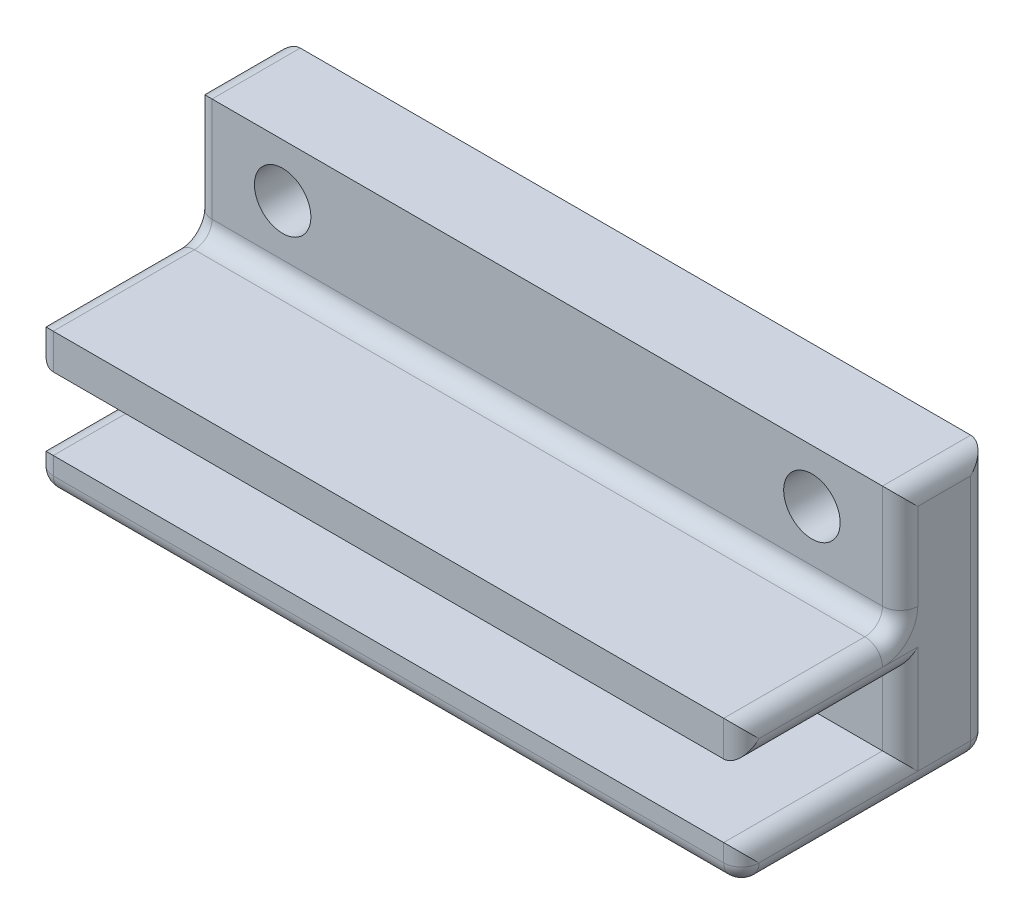
ISO-10303-21;
HEADER;
FILE_DESCRIPTION(('STEP AP214'),'2;1');
FILE_NAME('part.step','',(''),(''),'','','');
FILE_SCHEMA(('AUTOMOTIVE_DESIGN { 1 0 10303 214 1 1 1 1 }'));
ENDSEC;
DATA;
#1=APPLICATION_CONTEXT('core data for automotive mechanical design processes');
#2=APPLICATION_PROTOCOL_DEFINITION('international standard','automotive_design',2000,#1);
#3=PRODUCT_CONTEXT('',#1,'mechanical');
#4=PRODUCT('Part','Part','',(#3));
#5=PRODUCT_RELATED_PRODUCT_CATEGORY('part','',(#4));
#6=PRODUCT_DEFINITION_FORMATION('','',#4);
#7=PRODUCT_DEFINITION_CONTEXT('part definition',#1,'design');
#8=PRODUCT_DEFINITION('design','',#6,#7);
#9=PRODUCT_DEFINITION_SHAPE('','',#8);
#10=(LENGTH_UNIT() NAMED_UNIT(*) SI_UNIT(.MILLI.,.METRE.));
#11=(NAMED_UNIT(*) PLANE_ANGLE_UNIT() SI_UNIT($,.RADIAN.));
#12=(NAMED_UNIT(*) SI_UNIT($,.STERADIAN.) SOLID_ANGLE_UNIT());
#13=UNCERTAINTY_MEASURE_WITH_UNIT(LENGTH_MEASURE(1.E-05),#10,'distance_accuracy_value','');
#14=(GEOMETRIC_REPRESENTATION_CONTEXT(3) GLOBAL_UNCERTAINTY_ASSIGNED_CONTEXT((#13)) GLOBAL_UNIT_ASSIGNED_CONTEXT((#10,
#11,#12)) REPRESENTATION_CONTEXT('',''));
#15=CARTESIAN_POINT('',(0.,0.,0.));
#16=DIRECTION('',(0.,0.,1.));
#17=DIRECTION('',(1.,0.,0.));
#18=AXIS2_PLACEMENT_3D('',#15,#16,#17);
#19=CARTESIAN_POINT('',(20.,0.,5.));
#20=DIRECTION('',(-1.,0.,0.));
#21=DIRECTION('',(0.,-1.,0.));
#22=AXIS2_PLACEMENT_3D('',#19,#20,#21);
#23=PLANE('',#22);
#24=CARTESIAN_POINT('',(20.,1.6,6.));
#25=DIRECTION('',(-1.,0.,0.));
#26=DIRECTION('',(0.,-1.,0.));
#27=AXIS2_PLACEMENT_3D('',#24,#25,#26);
#28=CIRCLE('',#27,2.);
#29=CARTESIAN_POINT('',(20.,-0.400000000000001,6.));
#30=VERTEX_POINT('',#29);
#31=CARTESIAN_POINT('',(20.,1.6,4.));
#32=VERTEX_POINT('',#31);
#33=EDGE_CURVE('E11',#30,#32,#28,.F.);
#34=ORIENTED_EDGE('',*,*,#33,.F.);
#35=DIRECTION('',(0.,0.,-1.));
#36=VECTOR('',#35,1.);
#37=CARTESIAN_POINT('',(20.,-0.400000000000001,5.));
#38=LINE('',#37,#36);
#39=CARTESIAN_POINT('',(20.,-0.400000000000001,4.));
#40=VERTEX_POINT('',#39);
#41=EDGE_CURVE('E47',#30,#40,#38,.T.);
#42=ORIENTED_EDGE('',*,*,#41,.T.);
#43=DIRECTION('',(0.,1.,0.));
#44=VECTOR('',#43,1.);
#45=CARTESIAN_POINT('',(20.,-5.5,4.));
#46=LINE('',#45,#44);
#47=CARTESIAN_POINT('',(20.,-6.5,4.));
#48=VERTEX_POINT('',#47);
#49=EDGE_CURVE('E365',#40,#48,#46,.F.);
#50=ORIENTED_EDGE('',*,*,#49,.T.);
#51=DIRECTION('',(0.,0.,-1.));
#52=VECTOR('',#51,1.);
#53=CARTESIAN_POINT('',(20.,-6.5,5.));
#54=LINE('',#53,#52);
#55=CARTESIAN_POINT('',(20.,-6.5,1.));
#56=VERTEX_POINT('',#55);
#57=EDGE_CURVE('E367',#48,#56,#54,.T.);
#58=ORIENTED_EDGE('',*,*,#57,.T.);
#59=DIRECTION('',(0.,1.,0.));
#60=VECTOR('',#59,1.);
#61=CARTESIAN_POINT('',(20.,0.,1.));
#62=LINE('',#61,#60);
#63=CARTESIAN_POINT('',(20.,6.5,1.));
#64=VERTEX_POINT('',#63);
#65=EDGE_CURVE('E203',#56,#64,#62,.T.);
#66=ORIENTED_EDGE('',*,*,#65,.T.);
#67=DIRECTION('',(0.,0.,-1.));
#68=VECTOR('',#67,1.);
#69=CARTESIAN_POINT('',(20.,6.5,5.));
#70=LINE('',#69,#68);
#71=CARTESIAN_POINT('',(20.,6.5,4.));
#72=VERTEX_POINT('',#71);
#73=EDGE_CURVE('E199',#64,#72,#70,.F.);
#74=ORIENTED_EDGE('',*,*,#73,.T.);
#75=DIRECTION('',(0.,1.,0.));
#76=VECTOR('',#75,1.);
#77=CARTESIAN_POINT('',(20.,0.599999999999996,4.));
#78=LINE('',#77,#76);
#79=EDGE_CURVE('E201',#72,#32,#78,.F.);
#80=ORIENTED_EDGE('',*,*,#79,.T.);
#81=EDGE_LOOP('',(#34,#42,#50,#58,#66,#74,#80));
#82=FACE_BOUND('',#81,.T.);
#83=ADVANCED_FACE('F37',(#82),#23,.F.);
#84=CARTESIAN_POINT('',(0.,0.,5.));
#85=DIRECTION('',(0.,0.,1.));
#86=DIRECTION('',(1.,0.,0.));
#87=AXIS2_PLACEMENT_3D('',#84,#85,#86);
#88=PLANE('',#87);
#89=DIRECTION('',(-1.,0.,0.));
#90=VECTOR('',#89,1.);
#91=CARTESIAN_POINT('',(0.,-1.4,5.));
#92=LINE('',#91,#90);
#93=CARTESIAN_POINT('',(19.,-1.4,5.));
#94=VERTEX_POINT('',#93);
#95=CARTESIAN_POINT('',(-19.,-1.40000000000001,5.));
#96=VERTEX_POINT('',#95);
#97=EDGE_CURVE('E275',#94,#96,#92,.T.);
#98=ORIENTED_EDGE('',*,*,#97,.T.);
#99=DIRECTION('',(0.,1.,0.));
#100=VECTOR('',#99,1.);
#101=CARTESIAN_POINT('',(-19.,0.,5.));
#102=LINE('',#101,#100);
#103=CARTESIAN_POINT('',(-19.,-5.50000000000001,5.));
#104=VERTEX_POINT('',#103);
#105=EDGE_CURVE('E357',#96,#104,#102,.F.);
#106=ORIENTED_EDGE('',*,*,#105,.T.);
#107=DIRECTION('',(-1.,0.,0.));
#108=VECTOR('',#107,1.);
#109=CARTESIAN_POINT('',(0.,-5.5,5.));
#110=LINE('',#109,#108);
#111=CARTESIAN_POINT('',(19.,-5.5,5.));
#112=VERTEX_POINT('',#111);
#113=EDGE_CURVE('E264',#112,#104,#110,.T.);
#114=ORIENTED_EDGE('',*,*,#113,.F.);
#115=DIRECTION('',(0.,1.,0.));
#116=VECTOR('',#115,1.);
#117=CARTESIAN_POINT('',(19.,-1.4,5.));
#118=LINE('',#117,#116);
#119=EDGE_CURVE('E355',#112,#94,#118,.T.);
#120=ORIENTED_EDGE('',*,*,#119,.T.);
#121=EDGE_LOOP('',(#98,#106,#114,#120));
#122=FACE_BOUND('',#121,.T.);
#123=ADVANCED_FACE('F495',(#122),#88,.T.);
#124=CARTESIAN_POINT('',(-20.,0.,5.));
#125=DIRECTION('',(-1.,0.,0.));
#126=DIRECTION('',(0.,0.,1.));
#127=AXIS2_PLACEMENT_3D('',#124,#125,#126);
#128=PLANE('',#127);
#129=CARTESIAN_POINT('',(-20.,1.59999999999999,6.));
#130=DIRECTION('',(-1.,0.,0.));
#131=DIRECTION('',(0.,0.,1.));
#132=AXIS2_PLACEMENT_3D('',#129,#130,#131);
#133=CIRCLE('',#132,2.);
#134=CARTESIAN_POINT('',(-20.,1.59999999999999,4.));
#135=VERTEX_POINT('',#134);
#136=CARTESIAN_POINT('',(-20.,-0.400000000000006,6.));
#137=VERTEX_POINT('',#136);
#138=EDGE_CURVE('E329',#135,#137,#133,.T.);
#139=ORIENTED_EDGE('',*,*,#138,.F.);
#140=DIRECTION('',(0.,1.,0.));
#141=VECTOR('',#140,1.);
#142=CARTESIAN_POINT('',(-20.,0.,4.));
#143=LINE('',#142,#141);
#144=CARTESIAN_POINT('',(-20.,6.49999999999999,4.));
#145=VERTEX_POINT('',#144);
#146=EDGE_CURVE('E332',#135,#145,#143,.T.);
#147=ORIENTED_EDGE('',*,*,#146,.T.);
#148=DIRECTION('',(0.,0.,-1.));
#149=VECTOR('',#148,1.);
#150=CARTESIAN_POINT('',(-20.,6.49999999999999,5.));
#151=LINE('',#150,#149);
#152=CARTESIAN_POINT('',(-20.,6.49999999999999,1.));
#153=VERTEX_POINT('',#152);
#154=EDGE_CURVE('E319',#145,#153,#151,.T.);
#155=ORIENTED_EDGE('',*,*,#154,.T.);
#156=DIRECTION('',(0.,1.,0.));
#157=VECTOR('',#156,1.);
#158=CARTESIAN_POINT('',(-20.,-7.50000000000001,1.));
#159=LINE('',#158,#157);
#160=CARTESIAN_POINT('',(-20.,-6.50000000000001,1.));
#161=VERTEX_POINT('',#160);
#162=EDGE_CURVE('E321',#153,#161,#159,.F.);
#163=ORIENTED_EDGE('',*,*,#162,.T.);
#164=DIRECTION('',(0.,0.,-1.));
#165=VECTOR('',#164,1.);
#166=CARTESIAN_POINT('',(-20.,-6.50000000000001,14.));
#167=LINE('',#166,#165);
#168=CARTESIAN_POINT('',(-20.,-6.50000000000001,4.));
#169=VERTEX_POINT('',#168);
#170=EDGE_CURVE('E323',#161,#169,#167,.F.);
#171=ORIENTED_EDGE('',*,*,#170,.T.);
#172=DIRECTION('',(0.,1.,0.));
#173=VECTOR('',#172,1.);
#174=CARTESIAN_POINT('',(-20.,0.,4.));
#175=LINE('',#174,#173);
#176=CARTESIAN_POINT('',(-20.,-0.400000000000006,4.));
#177=VERTEX_POINT('',#176);
#178=EDGE_CURVE('E325',#169,#177,#175,.T.);
#179=ORIENTED_EDGE('',*,*,#178,.T.);
#180=DIRECTION('',(0.,0.,-1.));
#181=VECTOR('',#180,1.);
#182=CARTESIAN_POINT('',(-20.,-0.400000000000006,14.));
#183=LINE('',#182,#181);
#184=EDGE_CURVE('E327',#177,#137,#183,.F.);
#185=ORIENTED_EDGE('',*,*,#184,.T.);
#186=EDGE_LOOP('',(#139,#147,#155,#163,#171,#179,#185));
#187=FACE_BOUND('',#186,.T.);
#188=ADVANCED_FACE('F438',(#187),#128,.T.);
#189=CARTESIAN_POINT('',(0.,-7.5,5.));
#190=DIRECTION('',(0.,1.,0.));
#191=DIRECTION('',(-1.,0.,0.));
#192=AXIS2_PLACEMENT_3D('',#189,#190,#191);
#193=PLANE('',#192);
#194=DIRECTION('',(1.,0.,0.));
#195=VECTOR('',#194,1.);
#196=CARTESIAN_POINT('',(-20.,-7.50000000000001,13.));
#197=LINE('',#196,#195);
#198=CARTESIAN_POINT('',(19.,-7.5,13.));
#199=VERTEX_POINT('',#198);
#200=CARTESIAN_POINT('',(-19.,-7.50000000000001,13.));
#201=VERTEX_POINT('',#200);
#202=EDGE_CURVE('E307',#199,#201,#197,.F.);
#203=ORIENTED_EDGE('',*,*,#202,.T.);
#204=DIRECTION('',(0.,0.,-1.));
#205=VECTOR('',#204,1.);
#206=CARTESIAN_POINT('',(-19.,-7.50000000000001,0.));
#207=LINE('',#206,#205);
#208=CARTESIAN_POINT('',(-19.,-7.50000000000001,1.));
#209=VERTEX_POINT('',#208);
#210=EDGE_CURVE('E310',#201,#209,#207,.T.);
#211=ORIENTED_EDGE('',*,*,#210,.T.);
#212=DIRECTION('',(1.,0.,0.));
#213=VECTOR('',#212,1.);
#214=CARTESIAN_POINT('',(0.,-7.5,1.));
#215=LINE('',#214,#213);
#216=CARTESIAN_POINT('',(19.,-7.5,1.));
#217=VERTEX_POINT('',#216);
#218=EDGE_CURVE('E305',#209,#217,#215,.T.);
#219=ORIENTED_EDGE('',*,*,#218,.T.);
#220=DIRECTION('',(0.,0.,-1.));
#221=VECTOR('',#220,1.);
#222=CARTESIAN_POINT('',(19.,-7.5,5.));
#223=LINE('',#222,#221);
#224=EDGE_CURVE('E303',#217,#199,#223,.F.);
#225=ORIENTED_EDGE('',*,*,#224,.T.);
#226=EDGE_LOOP('',(#203,#211,#219,#225));
#227=FACE_BOUND('',#226,.T.);
#228=ADVANCED_FACE('F505',(#227),#193,.F.);
#229=CARTESIAN_POINT('',(-15.,4.49999999999999,5.));
#230=DIRECTION('',(0.,0.,-1.));
#231=DIRECTION('',(-1.,0.,0.));
#232=AXIS2_PLACEMENT_3D('',#229,#230,#231);
#233=CYLINDRICAL_SURFACE('',#232,1.6);
#234=CARTESIAN_POINT('',(-15.,4.49999999999999,5.));
#235=DIRECTION('',(0.,0.,1.));
#236=DIRECTION('',(1.,0.,0.));
#237=AXIS2_PLACEMENT_3D('',#234,#235,#236);
#238=CIRCLE('',#237,1.6);
#239=CARTESIAN_POINT('',(-13.4,4.49999999999999,5.));
#240=VERTEX_POINT('',#239);
#241=EDGE_CURVE('E282',#240,#240,#238,.T.);
#242=ORIENTED_EDGE('',*,*,#241,.T.);
#243=EDGE_LOOP('',(#242));
#244=FACE_BOUND('',#243,.T.);
#245=CARTESIAN_POINT('',(-15.,4.49999999999999,0.));
#246=DIRECTION('',(0.,0.,1.));
#247=DIRECTION('',(1.,0.,0.));
#248=AXIS2_PLACEMENT_3D('',#245,#246,#247);
#249=CIRCLE('',#248,1.6);
#250=CARTESIAN_POINT('',(-13.4,4.49999999999999,0.));
#251=VERTEX_POINT('',#250);
#252=EDGE_CURVE('E292',#251,#251,#249,.T.);
#253=ORIENTED_EDGE('',*,*,#252,.F.);
#254=EDGE_LOOP('',(#253));
#255=FACE_BOUND('',#254,.T.);
#256=ADVANCED_FACE('F508',(#244,#255),#233,.F.);
#257=CARTESIAN_POINT('',(0.,7.5,5.));
#258=DIRECTION('',(0.,1.,0.));
#259=DIRECTION('',(-1.,0.,0.));
#260=AXIS2_PLACEMENT_3D('',#257,#258,#259);
#261=PLANE('',#260);
#262=DIRECTION('',(1.,0.,0.));
#263=VECTOR('',#262,1.);
#264=CARTESIAN_POINT('',(0.,7.5,0.));
#265=LINE('',#264,#263);
#266=CARTESIAN_POINT('',(-19.,7.49999999999999,0.));
#267=VERTEX_POINT('',#266);
#268=CARTESIAN_POINT('',(19.,7.5,0.));
#269=VERTEX_POINT('',#268);
#270=EDGE_CURVE('E278',#267,#269,#265,.T.);
#271=ORIENTED_EDGE('',*,*,#270,.F.);
#272=DIRECTION('',(0.,0.,-1.));
#273=VECTOR('',#272,1.);
#274=CARTESIAN_POINT('',(-19.,7.49999999999999,5.));
#275=LINE('',#274,#273);
#276=CARTESIAN_POINT('',(-19.,7.49999999999999,5.));
#277=VERTEX_POINT('',#276);
#278=EDGE_CURVE('E363',#267,#277,#275,.F.);
#279=ORIENTED_EDGE('',*,*,#278,.T.);
#280=DIRECTION('',(1.,0.,0.));
#281=VECTOR('',#280,1.);
#282=CARTESIAN_POINT('',(0.,7.5,5.));
#283=LINE('',#282,#281);
#284=CARTESIAN_POINT('',(19.,7.5,5.));
#285=VERTEX_POINT('',#284);
#286=EDGE_CURVE('E279',#277,#285,#283,.T.);
#287=ORIENTED_EDGE('',*,*,#286,.T.);
#288=DIRECTION('',(0.,0.,-1.));
#289=VECTOR('',#288,1.);
#290=CARTESIAN_POINT('',(19.,7.5,0.));
#291=LINE('',#290,#289);
#292=EDGE_CURVE('E220',#285,#269,#291,.T.);
#293=ORIENTED_EDGE('',*,*,#292,.T.);
#294=EDGE_LOOP('',(#271,#279,#287,#293));
#295=FACE_BOUND('',#294,.T.);
#296=ADVANCED_FACE('F469',(#295),#261,.T.);
#297=CARTESIAN_POINT('',(15.,4.5,5.));
#298=DIRECTION('',(0.,0.,-1.));
#299=DIRECTION('',(-1.,0.,0.));
#300=AXIS2_PLACEMENT_3D('',#297,#298,#299);
#301=CYLINDRICAL_SURFACE('',#300,1.60000000000001);
#302=CARTESIAN_POINT('',(15.,4.5,5.));
#303=DIRECTION('',(0.,0.,1.));
#304=DIRECTION('',(1.,0.,0.));
#305=AXIS2_PLACEMENT_3D('',#302,#303,#304);
#306=CIRCLE('',#305,1.60000000000001);
#307=CARTESIAN_POINT('',(16.6,4.5,5.));
#308=VERTEX_POINT('',#307);
#309=EDGE_CURVE('E286',#308,#308,#306,.F.);
#310=ORIENTED_EDGE('',*,*,#309,.F.);
#311=EDGE_LOOP('',(#310));
#312=FACE_BOUND('',#311,.T.);
#313=CARTESIAN_POINT('',(15.,4.5,0.));
#314=DIRECTION('',(0.,0.,1.));
#315=DIRECTION('',(1.,0.,0.));
#316=AXIS2_PLACEMENT_3D('',#313,#314,#315);
#317=CIRCLE('',#316,1.60000000000001);
#318=CARTESIAN_POINT('',(16.6,4.5,0.));
#319=VERTEX_POINT('',#318);
#320=EDGE_CURVE('E283',#319,#319,#317,.F.);
#321=ORIENTED_EDGE('',*,*,#320,.T.);
#322=EDGE_LOOP('',(#321));
#323=FACE_BOUND('',#322,.T.);
#324=ADVANCED_FACE('F777',(#312,#323),#301,.F.);
#325=ORIENTED_EDGE('',*,*,#286,.F.);
#326=DIRECTION('',(0.,1.,0.));
#327=VECTOR('',#326,1.);
#328=CARTESIAN_POINT('',(-19.,0.,5.));
#329=LINE('',#328,#327);
#330=CARTESIAN_POINT('',(-19.,1.59999999999999,5.));
#331=VERTEX_POINT('',#330);
#332=EDGE_CURVE('E339',#277,#331,#329,.F.);
#333=ORIENTED_EDGE('',*,*,#332,.T.);
#334=DIRECTION('',(-1.,0.,0.));
#335=VECTOR('',#334,1.);
#336=CARTESIAN_POINT('',(20.,1.6,5.));
#337=LINE('',#336,#335);
#338=CARTESIAN_POINT('',(19.,1.6,5.));
#339=VERTEX_POINT('',#338);
#340=EDGE_CURVE('E335',#331,#339,#337,.F.);
#341=ORIENTED_EDGE('',*,*,#340,.T.);
#342=DIRECTION('',(0.,1.,0.));
#343=VECTOR('',#342,1.);
#344=CARTESIAN_POINT('',(19.,7.5,5.));
#345=LINE('',#344,#343);
#346=EDGE_CURVE('E337',#339,#285,#345,.T.);
#347=ORIENTED_EDGE('',*,*,#346,.T.);
#348=EDGE_LOOP('',(#325,#333,#341,#347));
#349=FACE_BOUND('',#348,.T.);
#350=ORIENTED_EDGE('',*,*,#241,.F.);
#351=EDGE_LOOP('',(#350));
#352=FACE_BOUND('',#351,.T.);
#353=ORIENTED_EDGE('',*,*,#309,.T.);
#354=EDGE_LOOP('',(#353));
#355=FACE_BOUND('',#354,.T.);
#356=ADVANCED_FACE('F463',(#349,#352,#355),#88,.T.);
#357=CARTESIAN_POINT('',(0.,0.,0.));
#358=DIRECTION('',(0.,0.,1.));
#359=DIRECTION('',(1.,0.,0.));
#360=AXIS2_PLACEMENT_3D('',#357,#358,#359);
#361=PLANE('',#360);
#362=DIRECTION('',(1.,0.,0.));
#363=VECTOR('',#362,1.);
#364=CARTESIAN_POINT('',(0.,-6.5,0.));
#365=LINE('',#364,#363);
#366=CARTESIAN_POINT('',(19.,-6.5,0.));
#367=VERTEX_POINT('',#366);
#368=CARTESIAN_POINT('',(-19.,-6.50000000000001,0.));
#369=VERTEX_POINT('',#368);
#370=EDGE_CURVE('E314',#367,#369,#365,.F.);
#371=ORIENTED_EDGE('',*,*,#370,.T.);
#372=DIRECTION('',(0.,1.,0.));
#373=VECTOR('',#372,1.);
#374=CARTESIAN_POINT('',(-19.,7.49999999999999,0.));
#375=LINE('',#374,#373);
#376=EDGE_CURVE('E317',#369,#267,#375,.T.);
#377=ORIENTED_EDGE('',*,*,#376,.T.);
#378=ORIENTED_EDGE('',*,*,#270,.T.);
#379=DIRECTION('',(0.,1.,0.));
#380=VECTOR('',#379,1.);
#381=CARTESIAN_POINT('',(19.,0.,0.));
#382=LINE('',#381,#380);
#383=EDGE_CURVE('E312',#269,#367,#382,.F.);
#384=ORIENTED_EDGE('',*,*,#383,.T.);
#385=EDGE_LOOP('',(#371,#377,#378,#384));
#386=FACE_BOUND('',#385,.T.);
#387=ORIENTED_EDGE('',*,*,#252,.T.);
#388=EDGE_LOOP('',(#387));
#389=FACE_BOUND('',#388,.T.);
#390=ORIENTED_EDGE('',*,*,#320,.F.);
#391=EDGE_LOOP('',(#390));
#392=FACE_BOUND('',#391,.T.);
#393=ADVANCED_FACE('F817',(#386,#389,#392),#361,.F.);
#394=CARTESIAN_POINT('',(0.,-1.4,14.));
#395=DIRECTION('',(0.,1.,0.));
#396=DIRECTION('',(-1.,0.,0.));
#397=AXIS2_PLACEMENT_3D('',#394,#395,#396);
#398=PLANE('',#397);
#399=DIRECTION('',(1.,0.,0.));
#400=VECTOR('',#399,1.);
#401=CARTESIAN_POINT('',(0.,-1.4,14.));
#402=LINE('',#401,#400);
#403=CARTESIAN_POINT('',(-19.,-1.40000000000001,14.));
#404=VERTEX_POINT('',#403);
#405=CARTESIAN_POINT('',(19.,-1.4,14.));
#406=VERTEX_POINT('',#405);
#407=EDGE_CURVE('E267',#404,#406,#402,.T.);
#408=ORIENTED_EDGE('',*,*,#407,.F.);
#409=DIRECTION('',(0.,0.,-1.));
#410=VECTOR('',#409,1.);
#411=CARTESIAN_POINT('',(-19.,-1.40000000000001,5.));
#412=LINE('',#411,#410);
#413=EDGE_CURVE('E353',#404,#96,#412,.T.);
#414=ORIENTED_EDGE('',*,*,#413,.T.);
#415=ORIENTED_EDGE('',*,*,#97,.F.);
#416=DIRECTION('',(0.,0.,-1.));
#417=VECTOR('',#416,1.);
#418=CARTESIAN_POINT('',(19.,-1.4,14.));
#419=LINE('',#418,#417);
#420=EDGE_CURVE('E351',#94,#406,#419,.F.);
#421=ORIENTED_EDGE('',*,*,#420,.T.);
#422=EDGE_LOOP('',(#408,#414,#415,#421));
#423=FACE_BOUND('',#422,.T.);
#424=ADVANCED_FACE('F827',(#423),#398,.F.);
#425=CARTESIAN_POINT('',(0.,0.599999999999996,14.));
#426=DIRECTION('',(0.,1.,0.));
#427=DIRECTION('',(-1.,0.,0.));
#428=AXIS2_PLACEMENT_3D('',#425,#426,#427);
#429=PLANE('',#428);
#430=DIRECTION('',(-1.,0.,0.));
#431=VECTOR('',#430,1.);
#432=CARTESIAN_POINT('',(-20.,0.599999999999994,6.));
#433=LINE('',#432,#431);
#434=CARTESIAN_POINT('',(19.,0.599999999999998,6.));
#435=VERTEX_POINT('',#434);
#436=CARTESIAN_POINT('',(-19.,0.599999999999994,6.));
#437=VERTEX_POINT('',#436);
#438=EDGE_CURVE('E341',#435,#437,#433,.T.);
#439=ORIENTED_EDGE('',*,*,#438,.T.);
#440=DIRECTION('',(0.,0.,-1.));
#441=VECTOR('',#440,1.);
#442=CARTESIAN_POINT('',(-19.,0.599999999999994,14.));
#443=LINE('',#442,#441);
#444=CARTESIAN_POINT('',(-19.,0.599999999999994,14.));
#445=VERTEX_POINT('',#444);
#446=EDGE_CURVE('E345',#437,#445,#443,.F.);
#447=ORIENTED_EDGE('',*,*,#446,.T.);
#448=DIRECTION('',(1.,0.,0.));
#449=VECTOR('',#448,1.);
#450=CARTESIAN_POINT('',(0.,0.599999999999996,14.));
#451=LINE('',#450,#449);
#452=CARTESIAN_POINT('',(19.,0.599999999999998,14.));
#453=VERTEX_POINT('',#452);
#454=EDGE_CURVE('E272',#445,#453,#451,.T.);
#455=ORIENTED_EDGE('',*,*,#454,.T.);
#456=DIRECTION('',(0.,0.,-1.));
#457=VECTOR('',#456,1.);
#458=CARTESIAN_POINT('',(19.,0.599999999999999,5.));
#459=LINE('',#458,#457);
#460=EDGE_CURVE('E343',#453,#435,#459,.T.);
#461=ORIENTED_EDGE('',*,*,#460,.T.);
#462=EDGE_LOOP('',(#439,#447,#455,#461));
#463=FACE_BOUND('',#462,.T.);
#464=ADVANCED_FACE('F446',(#463),#429,.T.);
#465=CARTESIAN_POINT('',(0.,0.,14.));
#466=DIRECTION('',(0.,0.,1.));
#467=DIRECTION('',(1.,0.,0.));
#468=AXIS2_PLACEMENT_3D('',#465,#466,#467);
#469=PLANE('',#468);
#470=ORIENTED_EDGE('',*,*,#454,.F.);
#471=DIRECTION('',(0.,1.,0.));
#472=VECTOR('',#471,1.);
#473=CARTESIAN_POINT('',(-19.,0.,14.));
#474=LINE('',#473,#472);
#475=EDGE_CURVE('E349',#445,#404,#474,.F.);
#476=ORIENTED_EDGE('',*,*,#475,.T.);
#477=ORIENTED_EDGE('',*,*,#407,.T.);
#478=DIRECTION('',(0.,1.,0.));
#479=VECTOR('',#478,1.);
#480=CARTESIAN_POINT('',(19.,0.599999999999996,14.));
#481=LINE('',#480,#479);
#482=EDGE_CURVE('E347',#406,#453,#481,.T.);
#483=ORIENTED_EDGE('',*,*,#482,.T.);
#484=EDGE_LOOP('',(#470,#476,#477,#483));
#485=FACE_BOUND('',#484,.T.);
#486=ADVANCED_FACE('F449',(#485),#469,.T.);
#487=CARTESIAN_POINT('',(0.,-5.5,14.));
#488=DIRECTION('',(0.,1.,0.));
#489=DIRECTION('',(-1.,0.,0.));
#490=AXIS2_PLACEMENT_3D('',#487,#488,#489);
#491=PLANE('',#490);
#492=ORIENTED_EDGE('',*,*,#113,.T.);
#493=DIRECTION('',(0.,0.,-1.));
#494=VECTOR('',#493,1.);
#495=CARTESIAN_POINT('',(-19.,-5.50000000000001,14.));
#496=LINE('',#495,#494);
#497=CARTESIAN_POINT('',(-19.,-5.50000000000001,14.));
#498=VERTEX_POINT('',#497);
#499=EDGE_CURVE('E88',#104,#498,#496,.F.);
#500=ORIENTED_EDGE('',*,*,#499,.T.);
#501=DIRECTION('',(1.,0.,0.));
#502=VECTOR('',#501,1.);
#503=CARTESIAN_POINT('',(0.,-5.5,14.));
#504=LINE('',#503,#502);
#505=CARTESIAN_POINT('',(19.,-5.5,14.));
#506=VERTEX_POINT('',#505);
#507=EDGE_CURVE('E259',#498,#506,#504,.T.);
#508=ORIENTED_EDGE('',*,*,#507,.T.);
#509=DIRECTION('',(0.,0.,-1.));
#510=VECTOR('',#509,1.);
#511=CARTESIAN_POINT('',(19.,-5.5,5.));
#512=LINE('',#511,#510);
#513=EDGE_CURVE('E359',#506,#112,#512,.T.);
#514=ORIENTED_EDGE('',*,*,#513,.T.);
#515=EDGE_LOOP('',(#492,#500,#508,#514));
#516=FACE_BOUND('',#515,.T.);
#517=ADVANCED_FACE('F491',(#516),#491,.T.);
#518=CARTESIAN_POINT('',(0.,0.,14.));
#519=DIRECTION('',(0.,0.,1.));
#520=DIRECTION('',(1.,0.,0.));
#521=AXIS2_PLACEMENT_3D('',#518,#519,#520);
#522=PLANE('',#521);
#523=ORIENTED_EDGE('',*,*,#507,.F.);
#524=DIRECTION('',(0.,1.,0.));
#525=VECTOR('',#524,1.);
#526=CARTESIAN_POINT('',(-19.,0.,14.));
#527=LINE('',#526,#525);
#528=CARTESIAN_POINT('',(-19.,-6.50000000000001,14.));
#529=VERTEX_POINT('',#528);
#530=EDGE_CURVE('E301',#498,#529,#527,.F.);
#531=ORIENTED_EDGE('',*,*,#530,.T.);
#532=DIRECTION('',(1.,0.,0.));
#533=VECTOR('',#532,1.);
#534=CARTESIAN_POINT('',(20.,-6.5,14.));
#535=LINE('',#534,#533);
#536=CARTESIAN_POINT('',(19.,-6.5,14.));
#537=VERTEX_POINT('',#536);
#538=EDGE_CURVE('E298',#529,#537,#535,.T.);
#539=ORIENTED_EDGE('',*,*,#538,.T.);
#540=DIRECTION('',(0.,1.,0.));
#541=VECTOR('',#540,1.);
#542=CARTESIAN_POINT('',(19.,-5.5,14.));
#543=LINE('',#542,#541);
#544=EDGE_CURVE('E289',#537,#506,#543,.T.);
#545=ORIENTED_EDGE('',*,*,#544,.T.);
#546=EDGE_LOOP('',(#523,#531,#539,#545));
#547=FACE_BOUND('',#546,.T.);
#548=ADVANCED_FACE('F486',(#547),#522,.T.);
#549=CARTESIAN_POINT('',(0.,1.6,6.));
#550=DIRECTION('',(1.,0.,0.));
#551=DIRECTION('',(0.,1.,0.));
#552=AXIS2_PLACEMENT_3D('',#549,#550,#551);
#553=CYLINDRICAL_SURFACE('',#552,1.);
#554=CARTESIAN_POINT('',(-19.,1.59999999999999,6.));
#555=DIRECTION('',(-1.,0.,0.));
#556=DIRECTION('',(0.,0.,1.));
#557=AXIS2_PLACEMENT_3D('',#554,#555,#556);
#558=CIRCLE('',#557,1.);
#559=EDGE_CURVE('E41',#437,#331,#558,.F.);
#560=ORIENTED_EDGE('',*,*,#559,.F.);
#561=ORIENTED_EDGE('',*,*,#438,.F.);
#562=CARTESIAN_POINT('',(19.,1.6,6.));
#563=DIRECTION('',(-1.,0.,0.));
#564=DIRECTION('',(0.,-1.,0.));
#565=AXIS2_PLACEMENT_3D('',#562,#563,#564);
#566=CIRCLE('',#565,1.);
#567=EDGE_CURVE('E254',#339,#435,#566,.T.);
#568=ORIENTED_EDGE('',*,*,#567,.F.);
#569=ORIENTED_EDGE('',*,*,#340,.F.);
#570=EDGE_LOOP('',(#560,#561,#568,#569));
#571=FACE_BOUND('',#570,.T.);
#572=ADVANCED_FACE('F39',(#571),#553,.F.);
#573=CARTESIAN_POINT('',(-19.,1.59999999999999,6.));
#574=DIRECTION('',(-1.,0.,0.));
#575=DIRECTION('',(0.,0.,1.));
#576=AXIS2_PLACEMENT_3D('',#573,#574,#575);
#577=TOROIDAL_SURFACE('',#576,2.,1.);
#578=CARTESIAN_POINT('',(-19.,-0.400000000000006,6.));
#579=DIRECTION('',(0.,0.,-1.));
#580=DIRECTION('',(-1.,0.,0.));
#581=AXIS2_PLACEMENT_3D('',#578,#579,#580);
#582=CIRCLE('',#581,1.);
#583=EDGE_CURVE('E249',#437,#137,#582,.F.);
#584=ORIENTED_EDGE('',*,*,#583,.F.);
#585=ORIENTED_EDGE('',*,*,#559,.T.);
#586=CARTESIAN_POINT('',(-19.,1.59999999999999,4.));
#587=DIRECTION('',(0.,-1.,0.));
#588=DIRECTION('',(0.,0.,-1.));
#589=AXIS2_PLACEMENT_3D('',#586,#587,#588);
#590=CIRCLE('',#589,1.);
#591=EDGE_CURVE('E252',#135,#331,#590,.F.);
#592=ORIENTED_EDGE('',*,*,#591,.F.);
#593=ORIENTED_EDGE('',*,*,#138,.T.);
#594=EDGE_LOOP('',(#584,#585,#592,#593));
#595=FACE_BOUND('',#594,.T.);
#596=ADVANCED_FACE('F439',(#595),#577,.T.);
#597=CARTESIAN_POINT('',(19.,1.6,6.));
#598=DIRECTION('',(-1.,0.,0.));
#599=DIRECTION('',(0.,-1.,0.));
#600=AXIS2_PLACEMENT_3D('',#597,#598,#599);
#601=TOROIDAL_SURFACE('',#600,2.,1.);
#602=CARTESIAN_POINT('',(19.,1.6,4.));
#603=DIRECTION('',(0.,-1.,0.));
#604=DIRECTION('',(1.,0.,0.));
#605=AXIS2_PLACEMENT_3D('',#602,#603,#604);
#606=CIRCLE('',#605,1.);
#607=EDGE_CURVE('E217',#339,#32,#606,.F.);
#608=ORIENTED_EDGE('',*,*,#607,.F.);
#609=ORIENTED_EDGE('',*,*,#567,.T.);
#610=CARTESIAN_POINT('',(19.,-0.400000000000002,6.));
#611=DIRECTION('',(0.,0.,-1.));
#612=DIRECTION('',(-1.,0.,0.));
#613=AXIS2_PLACEMENT_3D('',#610,#611,#612);
#614=CIRCLE('',#613,1.);
#615=EDGE_CURVE('E244',#30,#435,#614,.F.);
#616=ORIENTED_EDGE('',*,*,#615,.F.);
#617=ORIENTED_EDGE('',*,*,#33,.T.);
#618=EDGE_LOOP('',(#608,#609,#616,#617));
#619=FACE_BOUND('',#618,.T.);
#620=ADVANCED_FACE('F460',(#619),#601,.T.);
#621=CARTESIAN_POINT('',(-19.,0.,4.));
#622=DIRECTION('',(0.,1.,0.));
#623=DIRECTION('',(0.,0.,1.));
#624=AXIS2_PLACEMENT_3D('',#621,#622,#623);
#625=CYLINDRICAL_SURFACE('',#624,1.);
#626=ORIENTED_EDGE('',*,*,#591,.T.);
#627=ORIENTED_EDGE('',*,*,#332,.F.);
#628=CARTESIAN_POINT('',(-19.,6.49999999999999,4.));
#629=DIRECTION('',(0.,0.707106781186547,-0.707106781186547));
#630=DIRECTION('',(0.,-0.707106781186547,-0.707106781186547));
#631=AXIS2_PLACEMENT_3D('',#628,#629,#630);
#632=ELLIPSE('',#631,1.41421356237309,1.);
#633=EDGE_CURVE('E240',#145,#277,#632,.T.);
#634=ORIENTED_EDGE('',*,*,#633,.F.);
#635=ORIENTED_EDGE('',*,*,#146,.F.);
#636=EDGE_LOOP('',(#626,#627,#634,#635));
#637=FACE_BOUND('',#636,.T.);
#638=ADVANCED_FACE('F483',(#637),#625,.T.);
#639=CARTESIAN_POINT('',(-19.,-0.400000000000006,5.));
#640=DIRECTION('',(0.,0.,-1.));
#641=DIRECTION('',(-1.,0.,0.));
#642=AXIS2_PLACEMENT_3D('',#639,#640,#641);
#643=CYLINDRICAL_SURFACE('',#642,1.);
#644=CARTESIAN_POINT('',(-19.,-0.400000000000006,13.));
#645=DIRECTION('',(0.,0.707106781186547,-0.707106781186547));
#646=DIRECTION('',(0.,0.707106781186547,0.707106781186547));
#647=AXIS2_PLACEMENT_3D('',#644,#645,#646);
#648=ELLIPSE('',#647,1.41421356237309,1.);
#649=CARTESIAN_POINT('',(-20.,-0.400000000000006,13.));
#650=VERTEX_POINT('',#649);
#651=EDGE_CURVE('E79',#445,#650,#648,.F.);
#652=ORIENTED_EDGE('',*,*,#651,.F.);
#653=ORIENTED_EDGE('',*,*,#446,.F.);
#654=ORIENTED_EDGE('',*,*,#583,.T.);
#655=DIRECTION('',(0.,0.,-1.));
#656=VECTOR('',#655,1.);
#657=CARTESIAN_POINT('',(-20.,-0.400000000000006,5.));
#658=LINE('',#657,#656);
#659=EDGE_CURVE('E237',#650,#137,#658,.T.);
#660=ORIENTED_EDGE('',*,*,#659,.F.);
#661=EDGE_LOOP('',(#652,#653,#654,#660));
#662=FACE_BOUND('',#661,.T.);
#663=ADVANCED_FACE('F443',(#662),#643,.T.);
#664=CARTESIAN_POINT('',(-19.,0.,13.));
#665=DIRECTION('',(0.,1.,0.));
#666=DIRECTION('',(0.,0.,1.));
#667=AXIS2_PLACEMENT_3D('',#664,#665,#666);
#668=CYLINDRICAL_SURFACE('',#667,1.);
#669=ORIENTED_EDGE('',*,*,#475,.F.);
#670=ORIENTED_EDGE('',*,*,#651,.T.);
#671=CARTESIAN_POINT('',(-19.,-0.400000000000006,13.));
#672=DIRECTION('',(0.,0.707106781186547,0.707106781186547));
#673=DIRECTION('',(0.,-0.707106781186547,0.707106781186547));
#674=AXIS2_PLACEMENT_3D('',#671,#672,#673);
#675=ELLIPSE('',#674,1.41421356237309,1.);
#676=EDGE_CURVE('E234',#404,#650,#675,.F.);
#677=ORIENTED_EDGE('',*,*,#676,.F.);
#678=EDGE_LOOP('',(#669,#670,#677));
#679=FACE_BOUND('',#678,.T.);
#680=ADVANCED_FACE('F586',(#679),#668,.T.);
#681=CARTESIAN_POINT('',(19.,0.,13.));
#682=DIRECTION('',(0.,-1.,0.));
#683=DIRECTION('',(1.,0.,0.));
#684=AXIS2_PLACEMENT_3D('',#681,#682,#683);
#685=CYLINDRICAL_SURFACE('',#684,1.);
#686=CARTESIAN_POINT('',(19.,-0.400000000000002,13.));
#687=DIRECTION('',(0.,-0.707106781186547,0.707106781186547));
#688=DIRECTION('',(0.,0.707106781186547,0.707106781186547));
#689=AXIS2_PLACEMENT_3D('',#686,#687,#688);
#690=ELLIPSE('',#689,1.41421356237309,1.);
#691=CARTESIAN_POINT('',(20.,-0.400000000000001,13.));
#692=VERTEX_POINT('',#691);
#693=EDGE_CURVE('E71',#453,#692,#690,.F.);
#694=ORIENTED_EDGE('',*,*,#693,.F.);
#695=ORIENTED_EDGE('',*,*,#482,.F.);
#696=CARTESIAN_POINT('',(19.,-0.400000000000001,13.));
#697=DIRECTION('',(0.,-0.707106781186547,-0.707106781186547));
#698=DIRECTION('',(0.,-0.707106781186547,0.707106781186547));
#699=AXIS2_PLACEMENT_3D('',#696,#697,#698);
#700=ELLIPSE('',#699,1.41421356237309,1.);
#701=EDGE_CURVE('E225',#692,#406,#700,.T.);
#702=ORIENTED_EDGE('',*,*,#701,.F.);
#703=EDGE_LOOP('',(#694,#695,#702));
#704=FACE_BOUND('',#703,.T.);
#705=ADVANCED_FACE('F453',(#704),#685,.T.);
#706=CARTESIAN_POINT('',(19.,-0.400000000000002,14.));
#707=DIRECTION('',(0.,0.,1.));
#708=DIRECTION('',(1.,0.,0.));
#709=AXIS2_PLACEMENT_3D('',#706,#707,#708);
#710=CYLINDRICAL_SURFACE('',#709,1.);
#711=ORIENTED_EDGE('',*,*,#460,.F.);
#712=ORIENTED_EDGE('',*,*,#693,.T.);
#713=DIRECTION('',(0.,0.,-1.));
#714=VECTOR('',#713,1.);
#715=CARTESIAN_POINT('',(20.,-0.400000000000001,14.));
#716=LINE('',#715,#714);
#717=EDGE_CURVE('E221',#30,#692,#716,.F.);
#718=ORIENTED_EDGE('',*,*,#717,.F.);
#719=ORIENTED_EDGE('',*,*,#615,.T.);
#720=EDGE_LOOP('',(#711,#712,#718,#719));
#721=FACE_BOUND('',#720,.T.);
#722=ADVANCED_FACE('F459',(#721),#710,.T.);
#723=CARTESIAN_POINT('',(19.,0.,4.));
#724=DIRECTION('',(0.,-1.,0.));
#725=DIRECTION('',(1.,0.,0.));
#726=AXIS2_PLACEMENT_3D('',#723,#724,#725);
#727=CYLINDRICAL_SURFACE('',#726,1.);
#728=ORIENTED_EDGE('',*,*,#607,.T.);
#729=ORIENTED_EDGE('',*,*,#79,.F.);
#730=CARTESIAN_POINT('',(19.,6.5,4.));
#731=DIRECTION('',(0.,-0.707106781186547,0.707106781186547));
#732=DIRECTION('',(0.,0.707106781186547,0.707106781186547));
#733=AXIS2_PLACEMENT_3D('',#730,#731,#732);
#734=ELLIPSE('',#733,1.41421356237309,1.);
#735=EDGE_CURVE('E214',#285,#72,#734,.F.);
#736=ORIENTED_EDGE('',*,*,#735,.F.);
#737=ORIENTED_EDGE('',*,*,#346,.F.);
#738=EDGE_LOOP('',(#728,#729,#736,#737));
#739=FACE_BOUND('',#738,.T.);
#740=ADVANCED_FACE('F212',(#739),#727,.T.);
#741=CARTESIAN_POINT('',(-19.,6.49999999999999,5.));
#742=DIRECTION('',(0.,0.,-1.));
#743=DIRECTION('',(-1.,0.,0.));
#744=AXIS2_PLACEMENT_3D('',#741,#742,#743);
#745=CYLINDRICAL_SURFACE('',#744,1.);
#746=ORIENTED_EDGE('',*,*,#633,.T.);
#747=ORIENTED_EDGE('',*,*,#278,.F.);
#748=CARTESIAN_POINT('',(-19.,6.49999999999999,1.));
#749=DIRECTION('',(0.,-0.707106781186547,-0.707106781186547));
#750=DIRECTION('',(0.,0.707106781186547,-0.707106781186547));
#751=AXIS2_PLACEMENT_3D('',#748,#749,#750);
#752=ELLIPSE('',#751,1.41421356237309,1.);
#753=EDGE_CURVE('E222',#153,#267,#752,.T.);
#754=ORIENTED_EDGE('',*,*,#753,.F.);
#755=ORIENTED_EDGE('',*,*,#154,.F.);
#756=EDGE_LOOP('',(#746,#747,#754,#755));
#757=FACE_BOUND('',#756,.T.);
#758=ADVANCED_FACE('F473',(#757),#745,.T.);
#759=CARTESIAN_POINT('',(-19.,-0.400000000000006,14.));
#760=DIRECTION('',(0.,0.,1.));
#761=DIRECTION('',(1.,0.,0.));
#762=AXIS2_PLACEMENT_3D('',#759,#760,#761);
#763=CYLINDRICAL_SURFACE('',#762,1.);
#764=ORIENTED_EDGE('',*,*,#659,.T.);
#765=ORIENTED_EDGE('',*,*,#184,.F.);
#766=CARTESIAN_POINT('',(-19.,-0.400000000000006,4.));
#767=DIRECTION('',(0.,0.707106781186547,0.707106781186547));
#768=DIRECTION('',(0.,-0.707106781186547,0.707106781186547));
#769=AXIS2_PLACEMENT_3D('',#766,#767,#768);
#770=ELLIPSE('',#769,1.41421356237309,1.);
#771=EDGE_CURVE('E228',#96,#177,#770,.F.);
#772=ORIENTED_EDGE('',*,*,#771,.F.);
#773=ORIENTED_EDGE('',*,*,#413,.F.);
#774=ORIENTED_EDGE('',*,*,#676,.T.);
#775=EDGE_LOOP('',(#764,#765,#772,#773,#774));
#776=FACE_BOUND('',#775,.T.);
#777=ADVANCED_FACE('F436',(#776),#763,.T.);
#778=CARTESIAN_POINT('',(19.,-0.400000000000001,5.));
#779=DIRECTION('',(0.,0.,-1.));
#780=DIRECTION('',(-1.,0.,0.));
#781=AXIS2_PLACEMENT_3D('',#778,#779,#780);
#782=CYLINDRICAL_SURFACE('',#781,1.);
#783=ORIENTED_EDGE('',*,*,#701,.T.);
#784=ORIENTED_EDGE('',*,*,#420,.F.);
#785=CARTESIAN_POINT('',(19.,-0.400000000000001,4.));
#786=DIRECTION('',(0.,-0.707106781186547,-0.707106781186547));
#787=DIRECTION('',(0.,0.707106781186547,-0.707106781186547));
#788=AXIS2_PLACEMENT_3D('',#785,#786,#787);
#789=ELLIPSE('',#788,1.41421356237309,1.);
#790=EDGE_CURVE('E424',#40,#94,#789,.T.);
#791=ORIENTED_EDGE('',*,*,#790,.F.);
#792=ORIENTED_EDGE('',*,*,#41,.F.);
#793=ORIENTED_EDGE('',*,*,#717,.T.);
#794=EDGE_LOOP('',(#783,#784,#791,#792,#793));
#795=FACE_BOUND('',#794,.T.);
#796=ADVANCED_FACE('F456',(#795),#782,.T.);
#797=CARTESIAN_POINT('',(19.,6.5,5.));
#798=DIRECTION('',(0.,0.,1.));
#799=DIRECTION('',(1.,0.,0.));
#800=AXIS2_PLACEMENT_3D('',#797,#798,#799);
#801=CYLINDRICAL_SURFACE('',#800,1.);
#802=ORIENTED_EDGE('',*,*,#735,.T.);
#803=ORIENTED_EDGE('',*,*,#73,.F.);
#804=CARTESIAN_POINT('',(19.,6.5,1.));
#805=DIRECTION('',(0.,0.707106781186547,0.707106781186547));
#806=DIRECTION('',(0.,0.707106781186547,-0.707106781186547));
#807=AXIS2_PLACEMENT_3D('',#804,#805,#806);
#808=ELLIPSE('',#807,1.41421356237309,1.);
#809=EDGE_CURVE('E422',#269,#64,#808,.F.);
#810=ORIENTED_EDGE('',*,*,#809,.F.);
#811=ORIENTED_EDGE('',*,*,#292,.F.);
#812=EDGE_LOOP('',(#802,#803,#810,#811));
#813=FACE_BOUND('',#812,.T.);
#814=ADVANCED_FACE('F219',(#813),#801,.T.);
#815=CARTESIAN_POINT('',(-19.,0.,1.));
#816=DIRECTION('',(0.,-1.,0.));
#817=DIRECTION('',(0.,0.,-1.));
#818=AXIS2_PLACEMENT_3D('',#815,#816,#817);
#819=CYLINDRICAL_SURFACE('',#818,1.);
#820=ORIENTED_EDGE('',*,*,#753,.T.);
#821=ORIENTED_EDGE('',*,*,#376,.F.);
#822=CARTESIAN_POINT('',(-19.,-6.50000000000001,1.));
#823=DIRECTION('',(0.,-1.,0.));
#824=DIRECTION('',(0.,0.,-1.));
#825=AXIS2_PLACEMENT_3D('',#822,#823,#824);
#826=CIRCLE('',#825,1.);
#827=EDGE_CURVE('E417',#161,#369,#826,.T.);
#828=ORIENTED_EDGE('',*,*,#827,.F.);
#829=ORIENTED_EDGE('',*,*,#162,.F.);
#830=EDGE_LOOP('',(#820,#821,#828,#829));
#831=FACE_BOUND('',#830,.T.);
#832=ADVANCED_FACE('F478',(#831),#819,.T.);
#833=CARTESIAN_POINT('',(-19.,0.,4.));
#834=DIRECTION('',(0.,1.,0.));
#835=DIRECTION('',(0.,0.,1.));
#836=AXIS2_PLACEMENT_3D('',#833,#834,#835);
#837=CYLINDRICAL_SURFACE('',#836,1.);
#838=ORIENTED_EDGE('',*,*,#771,.T.);
#839=ORIENTED_EDGE('',*,*,#178,.F.);
#840=CARTESIAN_POINT('',(-19.,-6.50000000000001,4.));
#841=DIRECTION('',(0.,0.707106781186547,-0.707106781186547));
#842=DIRECTION('',(0.,0.707106781186547,0.707106781186547));
#843=AXIS2_PLACEMENT_3D('',#840,#841,#842);
#844=ELLIPSE('',#843,1.41421356237309,1.);
#845=EDGE_CURVE('E414',#104,#169,#844,.F.);
#846=ORIENTED_EDGE('',*,*,#845,.F.);
#847=ORIENTED_EDGE('',*,*,#105,.F.);
#848=EDGE_LOOP('',(#838,#839,#846,#847));
#849=FACE_BOUND('',#848,.T.);
#850=ADVANCED_FACE('F431',(#849),#837,.T.);
#851=CARTESIAN_POINT('',(19.,0.,4.));
#852=DIRECTION('',(0.,-1.,0.));
#853=DIRECTION('',(1.,0.,0.));
#854=AXIS2_PLACEMENT_3D('',#851,#852,#853);
#855=CYLINDRICAL_SURFACE('',#854,1.);
#856=ORIENTED_EDGE('',*,*,#790,.T.);
#857=ORIENTED_EDGE('',*,*,#119,.F.);
#858=CARTESIAN_POINT('',(19.,-6.5,4.));
#859=DIRECTION('',(0.,-0.707106781186547,0.707106781186547));
#860=DIRECTION('',(0.,0.707106781186547,0.707106781186547));
#861=AXIS2_PLACEMENT_3D('',#858,#859,#860);
#862=ELLIPSE('',#861,1.41421356237309,1.);
#863=EDGE_CURVE('E411',#48,#112,#862,.T.);
#864=ORIENTED_EDGE('',*,*,#863,.F.);
#865=ORIENTED_EDGE('',*,*,#49,.F.);
#866=EDGE_LOOP('',(#856,#857,#864,#865));
#867=FACE_BOUND('',#866,.T.);
#868=ADVANCED_FACE('F563',(#867),#855,.T.);
#869=CARTESIAN_POINT('',(19.,0.,1.));
#870=DIRECTION('',(0.,1.,0.));
#871=DIRECTION('',(-1.,0.,0.));
#872=AXIS2_PLACEMENT_3D('',#869,#870,#871);
#873=CYLINDRICAL_SURFACE('',#872,1.);
#874=ORIENTED_EDGE('',*,*,#809,.T.);
#875=ORIENTED_EDGE('',*,*,#65,.F.);
#876=CARTESIAN_POINT('',(19.,-6.5,1.));
#877=DIRECTION('',(0.,-1.,0.));
#878=DIRECTION('',(1.,0.,0.));
#879=AXIS2_PLACEMENT_3D('',#876,#877,#878);
#880=CIRCLE('',#879,1.);
#881=EDGE_CURVE('E408',#367,#56,#880,.T.);
#882=ORIENTED_EDGE('',*,*,#881,.F.);
#883=ORIENTED_EDGE('',*,*,#383,.F.);
#884=EDGE_LOOP('',(#874,#875,#882,#883));
#885=FACE_BOUND('',#884,.T.);
#886=ADVANCED_FACE('F559',(#885),#873,.T.);
#887=CARTESIAN_POINT('',(0.,-6.5,1.));
#888=DIRECTION('',(1.,0.,0.));
#889=DIRECTION('',(0.,1.,0.));
#890=AXIS2_PLACEMENT_3D('',#887,#888,#889);
#891=CYLINDRICAL_SURFACE('',#890,1.);
#892=CARTESIAN_POINT('',(-19.,-6.50000000000001,1.));
#893=DIRECTION('',(-1.,0.,0.));
#894=DIRECTION('',(0.,0.,1.));
#895=AXIS2_PLACEMENT_3D('',#892,#893,#894);
#896=CIRCLE('',#895,1.);
#897=EDGE_CURVE('E419',#369,#209,#896,.T.);
#898=ORIENTED_EDGE('',*,*,#897,.F.);
#899=ORIENTED_EDGE('',*,*,#370,.F.);
#900=CARTESIAN_POINT('',(19.,-6.5,1.));
#901=DIRECTION('',(1.,0.,0.));
#902=DIRECTION('',(0.,0.,-1.));
#903=AXIS2_PLACEMENT_3D('',#900,#901,#902);
#904=CIRCLE('',#903,1.);
#905=EDGE_CURVE('E405',#217,#367,#904,.T.);
#906=ORIENTED_EDGE('',*,*,#905,.F.);
#907=ORIENTED_EDGE('',*,*,#218,.F.);
#908=EDGE_LOOP('',(#898,#899,#906,#907));
#909=FACE_BOUND('',#908,.T.);
#910=ADVANCED_FACE('F555',(#909),#891,.T.);
#911=CARTESIAN_POINT('',(-19.,-6.50000000000001,1.));
#912=DIRECTION('',(0.,0.,-1.));
#913=DIRECTION('',(-1.,0.,0.));
#914=AXIS2_PLACEMENT_3D('',#911,#912,#913);
#915=SPHERICAL_SURFACE('',#914,1.);
#916=ORIENTED_EDGE('',*,*,#827,.T.);
#917=ORIENTED_EDGE('',*,*,#897,.T.);
#918=CARTESIAN_POINT('',(-19.,-6.50000000000001,1.));
#919=DIRECTION('',(0.,0.,-1.));
#920=DIRECTION('',(-1.,0.,0.));
#921=AXIS2_PLACEMENT_3D('',#918,#919,#920);
#922=CIRCLE('',#921,1.);
#923=EDGE_CURVE('E402',#161,#209,#922,.F.);
#924=ORIENTED_EDGE('',*,*,#923,.F.);
#925=EDGE_LOOP('',(#916,#917,#924));
#926=FACE_BOUND('',#925,.T.);
#927=ADVANCED_FACE('F551',(#926),#915,.T.);
#928=CARTESIAN_POINT('',(-19.,-6.50000000000001,5.));
#929=DIRECTION('',(0.,0.,-1.));
#930=DIRECTION('',(-1.,0.,0.));
#931=AXIS2_PLACEMENT_3D('',#928,#929,#930);
#932=CYLINDRICAL_SURFACE('',#931,1.);
#933=ORIENTED_EDGE('',*,*,#499,.F.);
#934=ORIENTED_EDGE('',*,*,#845,.T.);
#935=DIRECTION('',(0.,0.,-1.));
#936=VECTOR('',#935,1.);
#937=CARTESIAN_POINT('',(-20.,-6.50000000000001,5.));
#938=LINE('',#937,#936);
#939=CARTESIAN_POINT('',(-20.,-6.50000000000001,13.));
#940=VERTEX_POINT('',#939);
#941=EDGE_CURVE('E399',#940,#169,#938,.T.);
#942=ORIENTED_EDGE('',*,*,#941,.F.);
#943=CARTESIAN_POINT('',(-19.,-6.50000000000001,13.));
#944=DIRECTION('',(0.,0.707106781186547,-0.707106781186547));
#945=DIRECTION('',(0.,0.707106781186547,0.707106781186547));
#946=AXIS2_PLACEMENT_3D('',#943,#944,#945);
#947=ELLIPSE('',#946,1.41421356237309,1.);
#948=EDGE_CURVE('E396',#498,#940,#947,.F.);
#949=ORIENTED_EDGE('',*,*,#948,.F.);
#950=EDGE_LOOP('',(#933,#934,#942,#949));
#951=FACE_BOUND('',#950,.T.);
#952=ADVANCED_FACE('F547',(#951),#932,.T.);
#953=CARTESIAN_POINT('',(19.,-6.5,14.));
#954=DIRECTION('',(0.,0.,1.));
#955=DIRECTION('',(1.,0.,0.));
#956=AXIS2_PLACEMENT_3D('',#953,#954,#955);
#957=CYLINDRICAL_SURFACE('',#956,1.);
#958=ORIENTED_EDGE('',*,*,#863,.T.);
#959=ORIENTED_EDGE('',*,*,#513,.F.);
#960=CARTESIAN_POINT('',(19.,-6.5,13.));
#961=DIRECTION('',(0.,-0.707106781186547,0.707106781186547));
#962=DIRECTION('',(0.,0.707106781186547,0.707106781186547));
#963=AXIS2_PLACEMENT_3D('',#960,#961,#962);
#964=ELLIPSE('',#963,1.41421356237309,1.);
#965=CARTESIAN_POINT('',(20.,-6.5,13.));
#966=VERTEX_POINT('',#965);
#967=EDGE_CURVE('E393',#966,#506,#964,.T.);
#968=ORIENTED_EDGE('',*,*,#967,.F.);
#969=DIRECTION('',(0.,0.,-1.));
#970=VECTOR('',#969,1.);
#971=CARTESIAN_POINT('',(20.,-6.5,14.));
#972=LINE('',#971,#970);
#973=EDGE_CURVE('E390',#48,#966,#972,.F.);
#974=ORIENTED_EDGE('',*,*,#973,.F.);
#975=EDGE_LOOP('',(#958,#959,#968,#974));
#976=FACE_BOUND('',#975,.T.);
#977=ADVANCED_FACE('F543',(#976),#957,.T.);
#978=CARTESIAN_POINT('',(19.,-6.5,1.));
#979=DIRECTION('',(0.,0.,-1.));
#980=DIRECTION('',(-1.,0.,0.));
#981=AXIS2_PLACEMENT_3D('',#978,#979,#980);
#982=SPHERICAL_SURFACE('',#981,1.);
#983=ORIENTED_EDGE('',*,*,#905,.T.);
#984=ORIENTED_EDGE('',*,*,#881,.T.);
#985=CARTESIAN_POINT('',(19.,-6.5,1.));
#986=DIRECTION('',(0.,0.,-1.));
#987=DIRECTION('',(-1.,0.,0.));
#988=AXIS2_PLACEMENT_3D('',#985,#986,#987);
#989=CIRCLE('',#988,1.);
#990=EDGE_CURVE('E387',#217,#56,#989,.F.);
#991=ORIENTED_EDGE('',*,*,#990,.F.);
#992=EDGE_LOOP('',(#983,#984,#991));
#993=FACE_BOUND('',#992,.T.);
#994=ADVANCED_FACE('F539',(#993),#982,.T.);
#995=CARTESIAN_POINT('',(-19.,-6.50000000000001,5.));
#996=DIRECTION('',(0.,0.,1.));
#997=DIRECTION('',(1.,0.,0.));
#998=AXIS2_PLACEMENT_3D('',#995,#996,#997);
#999=CYLINDRICAL_SURFACE('',#998,1.);
#1000=ORIENTED_EDGE('',*,*,#923,.T.);
#1001=ORIENTED_EDGE('',*,*,#210,.F.);
#1002=CARTESIAN_POINT('',(-19.,-6.50000000000001,13.));
#1003=DIRECTION('',(0.,0.,1.));
#1004=DIRECTION('',(1.,0.,0.));
#1005=AXIS2_PLACEMENT_3D('',#1002,#1003,#1004);
#1006=CIRCLE('',#1005,1.);
#1007=EDGE_CURVE('E384',#940,#201,#1006,.T.);
#1008=ORIENTED_EDGE('',*,*,#1007,.F.);
#1009=ORIENTED_EDGE('',*,*,#941,.T.);
#1010=ORIENTED_EDGE('',*,*,#170,.F.);
#1011=EDGE_LOOP('',(#1000,#1001,#1008,#1009,#1010));
#1012=FACE_BOUND('',#1011,.T.);
#1013=ADVANCED_FACE('F535',(#1012),#999,.T.);
#1014=CARTESIAN_POINT('',(-19.,0.,13.));
#1015=DIRECTION('',(0.,1.,0.));
#1016=DIRECTION('',(0.,0.,1.));
#1017=AXIS2_PLACEMENT_3D('',#1014,#1015,#1016);
#1018=CYLINDRICAL_SURFACE('',#1017,1.);
#1019=ORIENTED_EDGE('',*,*,#530,.F.);
#1020=ORIENTED_EDGE('',*,*,#948,.T.);
#1021=CARTESIAN_POINT('',(-19.,-6.50000000000001,13.));
#1022=DIRECTION('',(0.,-1.,0.));
#1023=DIRECTION('',(0.,0.,-1.));
#1024=AXIS2_PLACEMENT_3D('',#1021,#1022,#1023);
#1025=CIRCLE('',#1024,1.);
#1026=EDGE_CURVE('E381',#529,#940,#1025,.T.);
#1027=ORIENTED_EDGE('',*,*,#1026,.F.);
#1028=EDGE_LOOP('',(#1019,#1020,#1027));
#1029=FACE_BOUND('',#1028,.T.);
#1030=ADVANCED_FACE('F531',(#1029),#1018,.T.);
#1031=CARTESIAN_POINT('',(19.,0.,13.));
#1032=DIRECTION('',(0.,-1.,0.));
#1033=DIRECTION('',(1.,0.,0.));
#1034=AXIS2_PLACEMENT_3D('',#1031,#1032,#1033);
#1035=CYLINDRICAL_SURFACE('',#1034,1.);
#1036=ORIENTED_EDGE('',*,*,#967,.T.);
#1037=ORIENTED_EDGE('',*,*,#544,.F.);
#1038=CARTESIAN_POINT('',(19.,-6.5,13.));
#1039=DIRECTION('',(0.,-1.,0.));
#1040=DIRECTION('',(1.,0.,0.));
#1041=AXIS2_PLACEMENT_3D('',#1038,#1039,#1040);
#1042=CIRCLE('',#1041,1.);
#1043=EDGE_CURVE('E378',#966,#537,#1042,.T.);
#1044=ORIENTED_EDGE('',*,*,#1043,.F.);
#1045=EDGE_LOOP('',(#1036,#1037,#1044));
#1046=FACE_BOUND('',#1045,.T.);
#1047=ADVANCED_FACE('F527',(#1046),#1035,.T.);
#1048=CARTESIAN_POINT('',(19.,-6.5,5.));
#1049=DIRECTION('',(0.,0.,-1.));
#1050=DIRECTION('',(-1.,0.,0.));
#1051=AXIS2_PLACEMENT_3D('',#1048,#1049,#1050);
#1052=CYLINDRICAL_SURFACE('',#1051,1.);
#1053=ORIENTED_EDGE('',*,*,#57,.F.);
#1054=ORIENTED_EDGE('',*,*,#973,.T.);
#1055=CARTESIAN_POINT('',(19.,-6.5,13.));
#1056=DIRECTION('',(0.,0.,1.));
#1057=DIRECTION('',(1.,0.,0.));
#1058=AXIS2_PLACEMENT_3D('',#1055,#1056,#1057);
#1059=CIRCLE('',#1058,1.);
#1060=EDGE_CURVE('E375',#199,#966,#1059,.T.);
#1061=ORIENTED_EDGE('',*,*,#1060,.F.);
#1062=ORIENTED_EDGE('',*,*,#224,.F.);
#1063=ORIENTED_EDGE('',*,*,#990,.T.);
#1064=EDGE_LOOP('',(#1053,#1054,#1061,#1062,#1063));
#1065=FACE_BOUND('',#1064,.T.);
#1066=ADVANCED_FACE('F523',(#1065),#1052,.T.);
#1067=CARTESIAN_POINT('',(-19.,-6.50000000000001,13.));
#1068=DIRECTION('',(-1.,0.,0.));
#1069=DIRECTION('',(0.,0.,1.));
#1070=AXIS2_PLACEMENT_3D('',#1067,#1068,#1069);
#1071=SPHERICAL_SURFACE('',#1070,1.);
#1072=ORIENTED_EDGE('',*,*,#1026,.T.);
#1073=ORIENTED_EDGE('',*,*,#1007,.T.);
#1074=CARTESIAN_POINT('',(-19.,-6.50000000000001,13.));
#1075=DIRECTION('',(-1.,0.,0.));
#1076=DIRECTION('',(0.,0.,1.));
#1077=AXIS2_PLACEMENT_3D('',#1074,#1075,#1076);
#1078=CIRCLE('',#1077,1.);
#1079=EDGE_CURVE('E373',#529,#201,#1078,.F.);
#1080=ORIENTED_EDGE('',*,*,#1079,.F.);
#1081=EDGE_LOOP('',(#1072,#1073,#1080));
#1082=FACE_BOUND('',#1081,.T.);
#1083=ADVANCED_FACE('F519',(#1082),#1071,.T.);
#1084=CARTESIAN_POINT('',(19.,-6.5,13.));
#1085=DIRECTION('',(1.,0.,0.));
#1086=DIRECTION('',(0.,1.,0.));
#1087=AXIS2_PLACEMENT_3D('',#1084,#1085,#1086);
#1088=SPHERICAL_SURFACE('',#1087,1.);
#1089=ORIENTED_EDGE('',*,*,#1060,.T.);
#1090=ORIENTED_EDGE('',*,*,#1043,.T.);
#1091=CARTESIAN_POINT('',(19.,-6.5,13.));
#1092=DIRECTION('',(1.,0.,0.));
#1093=DIRECTION('',(0.,0.,-1.));
#1094=AXIS2_PLACEMENT_3D('',#1091,#1092,#1093);
#1095=CIRCLE('',#1094,1.);
#1096=EDGE_CURVE('E371',#199,#537,#1095,.F.);
#1097=ORIENTED_EDGE('',*,*,#1096,.F.);
#1098=EDGE_LOOP('',(#1089,#1090,#1097));
#1099=FACE_BOUND('',#1098,.T.);
#1100=ADVANCED_FACE('F515',(#1099),#1088,.T.);
#1101=CARTESIAN_POINT('',(0.,-6.5,13.));
#1102=DIRECTION('',(-1.,0.,0.));
#1103=DIRECTION('',(0.,-1.,0.));
#1104=AXIS2_PLACEMENT_3D('',#1101,#1102,#1103);
#1105=CYLINDRICAL_SURFACE('',#1104,1.);
#1106=ORIENTED_EDGE('',*,*,#1079,.T.);
#1107=ORIENTED_EDGE('',*,*,#202,.F.);
#1108=ORIENTED_EDGE('',*,*,#1096,.T.);
#1109=ORIENTED_EDGE('',*,*,#538,.F.);
#1110=EDGE_LOOP('',(#1106,#1107,#1108,#1109));
#1111=FACE_BOUND('',#1110,.T.);
#1112=ADVANCED_FACE('F512',(#1111),#1105,.T.);
#1113=CLOSED_SHELL('',(#83,#123,#188,#228,#256,#296,#324,#356,#393,#424,#464,#486,#517,#548,
#572,#596,#620,#638,#663,#680,#705,#722,#740,#758,#777,#796,#814,#832,#850,#868,#886,#910,#927,
#952,#977,#994,#1013,#1030,#1047,#1066,#1083,#1100,#1112));
#1114=MANIFOLD_SOLID_BREP('B2',#1113);
#1115=ADVANCED_BREP_SHAPE_REPRESENTATION('',(#18,#1114),#14);
#1116=SHAPE_DEFINITION_REPRESENTATION(#9,#1115);
ENDSEC;
END-ISO-10303-21;
